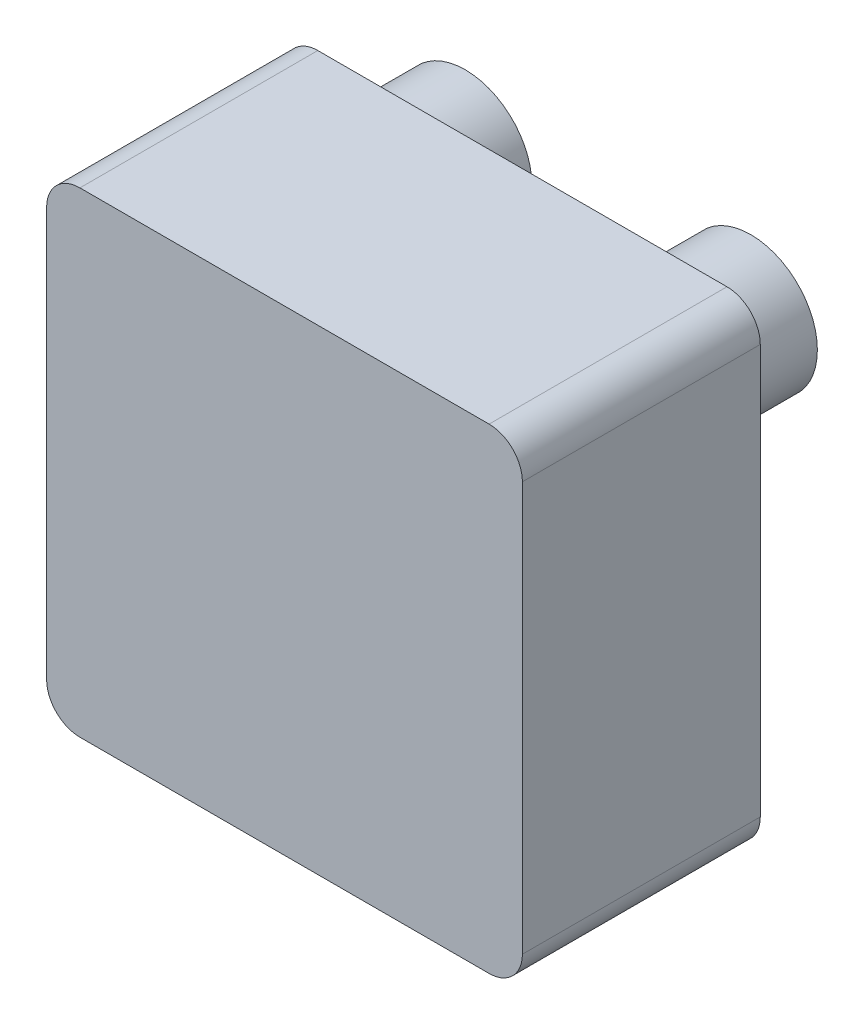
ISO-10303-21;
HEADER;
FILE_DESCRIPTION(('STEP AP214'),'2;1');
FILE_NAME('part.step','',(''),(''),'','','');
FILE_SCHEMA(('AUTOMOTIVE_DESIGN { 1 0 10303 214 1 1 1 1 }'));
ENDSEC;
DATA;
#1=APPLICATION_CONTEXT('core data for automotive mechanical design processes');
#2=APPLICATION_PROTOCOL_DEFINITION('international standard','automotive_design',2000,#1);
#3=PRODUCT_CONTEXT('',#1,'mechanical');
#4=PRODUCT('Part','Part','',(#3));
#5=PRODUCT_RELATED_PRODUCT_CATEGORY('part','',(#4));
#6=PRODUCT_DEFINITION_FORMATION('','',#4);
#7=PRODUCT_DEFINITION_CONTEXT('part definition',#1,'design');
#8=PRODUCT_DEFINITION('design','',#6,#7);
#9=PRODUCT_DEFINITION_SHAPE('','',#8);
#10=(LENGTH_UNIT() NAMED_UNIT(*) SI_UNIT(.MILLI.,.METRE.));
#11=(NAMED_UNIT(*) PLANE_ANGLE_UNIT() SI_UNIT($,.RADIAN.));
#12=(NAMED_UNIT(*) SI_UNIT($,.STERADIAN.) SOLID_ANGLE_UNIT());
#13=UNCERTAINTY_MEASURE_WITH_UNIT(LENGTH_MEASURE(1.E-05),#10,'distance_accuracy_value','');
#14=(GEOMETRIC_REPRESENTATION_CONTEXT(3) GLOBAL_UNCERTAINTY_ASSIGNED_CONTEXT((#13)) GLOBAL_UNIT_ASSIGNED_CONTEXT((#10,
#11,#12)) REPRESENTATION_CONTEXT('',''));
#15=CARTESIAN_POINT('',(0.,0.,0.));
#16=DIRECTION('',(0.,0.,1.));
#17=DIRECTION('',(1.,0.,0.));
#18=AXIS2_PLACEMENT_3D('',#15,#16,#17);
#19=CARTESIAN_POINT('',(0.,10.,0.));
#20=DIRECTION('',(1.,0.,0.));
#21=DIRECTION('',(0.,0.,-1.));
#22=AXIS2_PLACEMENT_3D('',#19,#20,#21);
#23=PLANE('',#22);
#24=DIRECTION('',(0.,-1.,0.));
#25=VECTOR('',#24,1.);
#26=CARTESIAN_POINT('',(0.,10.,-5.));
#27=LINE('',#26,#25);
#28=CARTESIAN_POINT('',(0.,9.3,-5.));
#29=VERTEX_POINT('',#28);
#30=CARTESIAN_POINT('',(0.,0.699999999999999,-5.));
#31=VERTEX_POINT('',#30);
#32=EDGE_CURVE('E241',#29,#31,#27,.T.);
#33=ORIENTED_EDGE('',*,*,#32,.T.);
#34=DIRECTION('',(0.,0.,1.));
#35=VECTOR('',#34,1.);
#36=CARTESIAN_POINT('',(0.,0.699999999999999,0.));
#37=LINE('',#36,#35);
#38=CARTESIAN_POINT('',(0.,0.699999999999999,0.));
#39=VERTEX_POINT('',#38);
#40=EDGE_CURVE('E287',#31,#39,#37,.T.);
#41=ORIENTED_EDGE('',*,*,#40,.T.);
#42=DIRECTION('',(0.,-1.,0.));
#43=VECTOR('',#42,1.);
#44=CARTESIAN_POINT('',(0.,10.,0.));
#45=LINE('',#44,#43);
#46=CARTESIAN_POINT('',(0.,9.3,0.));
#47=VERTEX_POINT('',#46);
#48=EDGE_CURVE('E254',#47,#39,#45,.T.);
#49=ORIENTED_EDGE('',*,*,#48,.F.);
#50=DIRECTION('',(0.,0.,1.));
#51=VECTOR('',#50,1.);
#52=CARTESIAN_POINT('',(0.,9.3,0.));
#53=LINE('',#52,#51);
#54=EDGE_CURVE('E285',#47,#29,#53,.F.);
#55=ORIENTED_EDGE('',*,*,#54,.T.);
#56=EDGE_LOOP('',(#33,#41,#49,#55));
#57=FACE_BOUND('',#56,.T.);
#58=ADVANCED_FACE('F38',(#57),#23,.F.);
#59=CARTESIAN_POINT('',(0.,10.,0.));
#60=DIRECTION('',(0.,0.,-1.));
#61=DIRECTION('',(-1.,0.,0.));
#62=AXIS2_PLACEMENT_3D('',#59,#60,#61);
#63=PLANE('',#62);
#64=DIRECTION('',(1.,0.,0.));
#65=VECTOR('',#64,1.);
#66=CARTESIAN_POINT('',(0.,0.,0.));
#67=LINE('',#66,#65);
#68=CARTESIAN_POINT('',(0.7,0.,0.));
#69=VERTEX_POINT('',#68);
#70=CARTESIAN_POINT('',(9.3,0.,0.));
#71=VERTEX_POINT('',#70);
#72=EDGE_CURVE('E233',#69,#71,#67,.T.);
#73=ORIENTED_EDGE('',*,*,#72,.T.);
#74=CARTESIAN_POINT('',(9.3,0.699999999999999,0.));
#75=DIRECTION('',(0.,0.,-1.));
#76=DIRECTION('',(-1.,0.,0.));
#77=AXIS2_PLACEMENT_3D('',#74,#75,#76);
#78=CIRCLE('',#77,0.7);
#79=CARTESIAN_POINT('',(10.,0.699999999999999,0.));
#80=VERTEX_POINT('',#79);
#81=EDGE_CURVE('E283',#71,#80,#78,.F.);
#82=ORIENTED_EDGE('',*,*,#81,.T.);
#83=DIRECTION('',(0.,-1.,0.));
#84=VECTOR('',#83,1.);
#85=CARTESIAN_POINT('',(10.,10.,0.));
#86=LINE('',#85,#84);
#87=CARTESIAN_POINT('',(10.,9.3,0.));
#88=VERTEX_POINT('',#87);
#89=EDGE_CURVE('E251',#88,#80,#86,.T.);
#90=ORIENTED_EDGE('',*,*,#89,.F.);
#91=CARTESIAN_POINT('',(9.3,9.3,0.));
#92=DIRECTION('',(0.,0.,-1.));
#93=DIRECTION('',(-1.,0.,0.));
#94=AXIS2_PLACEMENT_3D('',#91,#92,#93);
#95=CIRCLE('',#94,0.7);
#96=CARTESIAN_POINT('',(9.3,10.,0.));
#97=VERTEX_POINT('',#96);
#98=EDGE_CURVE('E279',#88,#97,#95,.F.);
#99=ORIENTED_EDGE('',*,*,#98,.T.);
#100=DIRECTION('',(1.,0.,0.));
#101=VECTOR('',#100,1.);
#102=CARTESIAN_POINT('',(0.,10.,0.));
#103=LINE('',#102,#101);
#104=CARTESIAN_POINT('',(0.7,10.,0.));
#105=VERTEX_POINT('',#104);
#106=EDGE_CURVE('E234',#105,#97,#103,.T.);
#107=ORIENTED_EDGE('',*,*,#106,.F.);
#108=CARTESIAN_POINT('',(0.7,9.3,0.));
#109=DIRECTION('',(0.,0.,-1.));
#110=DIRECTION('',(-1.,0.,0.));
#111=AXIS2_PLACEMENT_3D('',#108,#109,#110);
#112=CIRCLE('',#111,0.7);
#113=EDGE_CURVE('E61',#105,#47,#112,.F.);
#114=ORIENTED_EDGE('',*,*,#113,.T.);
#115=ORIENTED_EDGE('',*,*,#48,.T.);
#116=CARTESIAN_POINT('',(0.7,0.699999999999999,0.));
#117=DIRECTION('',(0.,0.,-1.));
#118=DIRECTION('',(-1.,0.,0.));
#119=AXIS2_PLACEMENT_3D('',#116,#117,#118);
#120=CIRCLE('',#119,0.7);
#121=EDGE_CURVE('E53',#39,#69,#120,.F.);
#122=ORIENTED_EDGE('',*,*,#121,.T.);
#123=EDGE_LOOP('',(#73,#82,#90,#99,#107,#114,#115,#122));
#124=FACE_BOUND('',#123,.T.);
#125=ADVANCED_FACE('F302',(#124),#63,.F.);
#126=CARTESIAN_POINT('',(10.,10.,0.));
#127=DIRECTION('',(-1.,0.,0.));
#128=DIRECTION('',(0.,0.,1.));
#129=AXIS2_PLACEMENT_3D('',#126,#127,#128);
#130=PLANE('',#129);
#131=ORIENTED_EDGE('',*,*,#89,.T.);
#132=DIRECTION('',(0.,0.,-1.));
#133=VECTOR('',#132,1.);
#134=CARTESIAN_POINT('',(10.,0.699999999999999,-5.));
#135=LINE('',#134,#133);
#136=CARTESIAN_POINT('',(10.,0.699999999999999,-5.));
#137=VERTEX_POINT('',#136);
#138=EDGE_CURVE('E264',#80,#137,#135,.T.);
#139=ORIENTED_EDGE('',*,*,#138,.T.);
#140=DIRECTION('',(0.,-1.,0.));
#141=VECTOR('',#140,1.);
#142=CARTESIAN_POINT('',(10.,10.,-5.));
#143=LINE('',#142,#141);
#144=CARTESIAN_POINT('',(10.,9.3,-5.));
#145=VERTEX_POINT('',#144);
#146=EDGE_CURVE('E249',#145,#137,#143,.T.);
#147=ORIENTED_EDGE('',*,*,#146,.F.);
#148=DIRECTION('',(0.,0.,-1.));
#149=VECTOR('',#148,1.);
#150=CARTESIAN_POINT('',(10.,9.3,0.));
#151=LINE('',#150,#149);
#152=EDGE_CURVE('E262',#145,#88,#151,.F.);
#153=ORIENTED_EDGE('',*,*,#152,.T.);
#154=EDGE_LOOP('',(#131,#139,#147,#153));
#155=FACE_BOUND('',#154,.T.);
#156=ADVANCED_FACE('F306',(#155),#130,.F.);
#157=CARTESIAN_POINT('',(0.,10.,-5.));
#158=DIRECTION('',(0.,0.,1.));
#159=DIRECTION('',(1.,0.,0.));
#160=AXIS2_PLACEMENT_3D('',#157,#158,#159);
#161=PLANE('',#160);
#162=CARTESIAN_POINT('',(2.,8.,-5.));
#163=DIRECTION('',(0.,0.,1.));
#164=DIRECTION('',(1.,0.,0.));
#165=AXIS2_PLACEMENT_3D('',#162,#163,#164);
#166=CIRCLE('',#165,1.4);
#167=CARTESIAN_POINT('',(3.4,8.,-5.));
#168=VERTEX_POINT('',#167);
#169=EDGE_CURVE('E259',#168,#168,#166,.F.);
#170=ORIENTED_EDGE('',*,*,#169,.F.);
#171=EDGE_LOOP('',(#170));
#172=FACE_BOUND('',#171,.T.);
#173=CARTESIAN_POINT('',(8.,8.,-5.));
#174=DIRECTION('',(0.,0.,1.));
#175=DIRECTION('',(1.,0.,0.));
#176=AXIS2_PLACEMENT_3D('',#173,#174,#175);
#177=CIRCLE('',#176,1.4);
#178=CARTESIAN_POINT('',(9.4,8.,-5.));
#179=VERTEX_POINT('',#178);
#180=EDGE_CURVE('E256',#179,#179,#177,.F.);
#181=ORIENTED_EDGE('',*,*,#180,.F.);
#182=EDGE_LOOP('',(#181));
#183=FACE_BOUND('',#182,.T.);
#184=ORIENTED_EDGE('',*,*,#146,.T.);
#185=CARTESIAN_POINT('',(9.3,0.699999999999999,-5.));
#186=DIRECTION('',(0.,0.,1.));
#187=DIRECTION('',(1.,0.,0.));
#188=AXIS2_PLACEMENT_3D('',#185,#186,#187);
#189=CIRCLE('',#188,0.7);
#190=CARTESIAN_POINT('',(9.3,0.,-5.));
#191=VERTEX_POINT('',#190);
#192=EDGE_CURVE('E273',#137,#191,#189,.F.);
#193=ORIENTED_EDGE('',*,*,#192,.T.);
#194=DIRECTION('',(-1.,0.,0.));
#195=VECTOR('',#194,1.);
#196=CARTESIAN_POINT('',(0.,0.,-5.));
#197=LINE('',#196,#195);
#198=CARTESIAN_POINT('',(7.5,0.,-5.));
#199=VERTEX_POINT('',#198);
#200=EDGE_CURVE('E238',#191,#199,#197,.T.);
#201=ORIENTED_EDGE('',*,*,#200,.T.);
#202=DIRECTION('',(0.,-1.,0.));
#203=VECTOR('',#202,1.);
#204=CARTESIAN_POINT('',(7.5,5.,-5.));
#205=LINE('',#204,#203);
#206=CARTESIAN_POINT('',(7.5,5.,-5.));
#207=VERTEX_POINT('',#206);
#208=EDGE_CURVE('E223',#207,#199,#205,.T.);
#209=ORIENTED_EDGE('',*,*,#208,.F.);
#210=DIRECTION('',(1.,0.,0.));
#211=VECTOR('',#210,1.);
#212=CARTESIAN_POINT('',(5.65,5.,-5.));
#213=LINE('',#212,#211);
#214=CARTESIAN_POINT('',(5.65,5.,-5.));
#215=VERTEX_POINT('',#214);
#216=EDGE_CURVE('E201',#215,#207,#213,.T.);
#217=ORIENTED_EDGE('',*,*,#216,.F.);
#218=DIRECTION('',(0.,-1.,0.));
#219=VECTOR('',#218,1.);
#220=CARTESIAN_POINT('',(5.65,5.,-5.));
#221=LINE('',#220,#219);
#222=CARTESIAN_POINT('',(5.65,0.,-5.));
#223=VERTEX_POINT('',#222);
#224=EDGE_CURVE('E211',#215,#223,#221,.T.);
#225=ORIENTED_EDGE('',*,*,#224,.T.);
#226=CARTESIAN_POINT('',(4.35,0.,-5.));
#227=VERTEX_POINT('',#226);
#228=EDGE_CURVE('E246',#223,#227,#197,.T.);
#229=ORIENTED_EDGE('',*,*,#228,.T.);
#230=DIRECTION('',(0.,-1.,0.));
#231=VECTOR('',#230,1.);
#232=CARTESIAN_POINT('',(4.35,5.,-5.));
#233=LINE('',#232,#231);
#234=CARTESIAN_POINT('',(4.35,5.,-5.));
#235=VERTEX_POINT('',#234);
#236=EDGE_CURVE('E164',#235,#227,#233,.T.);
#237=ORIENTED_EDGE('',*,*,#236,.F.);
#238=DIRECTION('',(1.,0.,0.));
#239=VECTOR('',#238,1.);
#240=CARTESIAN_POINT('',(2.5,5.,-5.));
#241=LINE('',#240,#239);
#242=CARTESIAN_POINT('',(2.5,5.,-5.));
#243=VERTEX_POINT('',#242);
#244=EDGE_CURVE('E171',#243,#235,#241,.T.);
#245=ORIENTED_EDGE('',*,*,#244,.F.);
#246=DIRECTION('',(0.,-1.,0.));
#247=VECTOR('',#246,1.);
#248=CARTESIAN_POINT('',(2.5,5.,-5.));
#249=LINE('',#248,#247);
#250=CARTESIAN_POINT('',(2.5,0.,-5.));
#251=VERTEX_POINT('',#250);
#252=EDGE_CURVE('E153',#243,#251,#249,.T.);
#253=ORIENTED_EDGE('',*,*,#252,.T.);
#254=CARTESIAN_POINT('',(0.699999999999999,0.,-5.));
#255=VERTEX_POINT('',#254);
#256=EDGE_CURVE('E244',#251,#255,#197,.T.);
#257=ORIENTED_EDGE('',*,*,#256,.T.);
#258=CARTESIAN_POINT('',(0.699999999999999,0.699999999999999,-5.));
#259=DIRECTION('',(0.,0.,1.));
#260=DIRECTION('',(1.,0.,0.));
#261=AXIS2_PLACEMENT_3D('',#258,#259,#260);
#262=CIRCLE('',#261,0.7);
#263=EDGE_CURVE('E271',#255,#31,#262,.F.);
#264=ORIENTED_EDGE('',*,*,#263,.T.);
#265=ORIENTED_EDGE('',*,*,#32,.F.);
#266=CARTESIAN_POINT('',(0.699999999999999,9.3,-5.));
#267=DIRECTION('',(0.,0.,1.));
#268=DIRECTION('',(1.,0.,0.));
#269=AXIS2_PLACEMENT_3D('',#266,#267,#268);
#270=CIRCLE('',#269,0.7);
#271=CARTESIAN_POINT('',(0.699999999999999,10.,-5.));
#272=VERTEX_POINT('',#271);
#273=EDGE_CURVE('E269',#29,#272,#270,.F.);
#274=ORIENTED_EDGE('',*,*,#273,.T.);
#275=DIRECTION('',(-1.,0.,0.));
#276=VECTOR('',#275,1.);
#277=CARTESIAN_POINT('',(0.,10.,-5.));
#278=LINE('',#277,#276);
#279=CARTESIAN_POINT('',(9.3,10.,-5.));
#280=VERTEX_POINT('',#279);
#281=EDGE_CURVE('E237',#280,#272,#278,.T.);
#282=ORIENTED_EDGE('',*,*,#281,.F.);
#283=CARTESIAN_POINT('',(9.3,9.3,-5.));
#284=DIRECTION('',(0.,0.,1.));
#285=DIRECTION('',(1.,0.,0.));
#286=AXIS2_PLACEMENT_3D('',#283,#284,#285);
#287=CIRCLE('',#286,0.7);
#288=EDGE_CURVE('E267',#280,#145,#287,.F.);
#289=ORIENTED_EDGE('',*,*,#288,.T.);
#290=EDGE_LOOP('',(#184,#193,#201,#209,#217,#225,#229,#237,#245,#253,#257,#264,#265,#274,#282,#289));
#291=FACE_BOUND('',#290,.T.);
#292=ADVANCED_FACE('F177',(#172,#183,#291),#161,.F.);
#293=CARTESIAN_POINT('',(0.,10.,0.));
#294=DIRECTION('',(0.,-1.,0.));
#295=DIRECTION('',(0.,0.,-1.));
#296=AXIS2_PLACEMENT_3D('',#293,#294,#295);
#297=PLANE('',#296);
#298=ORIENTED_EDGE('',*,*,#281,.T.);
#299=DIRECTION('',(0.,0.,1.));
#300=VECTOR('',#299,1.);
#301=CARTESIAN_POINT('',(0.7,10.,0.));
#302=LINE('',#301,#300);
#303=EDGE_CURVE('E11',#272,#105,#302,.T.);
#304=ORIENTED_EDGE('',*,*,#303,.T.);
#305=ORIENTED_EDGE('',*,*,#106,.T.);
#306=DIRECTION('',(0.,0.,-1.));
#307=VECTOR('',#306,1.);
#308=CARTESIAN_POINT('',(9.3,10.,0.));
#309=LINE('',#308,#307);
#310=EDGE_CURVE('E46',#97,#280,#309,.T.);
#311=ORIENTED_EDGE('',*,*,#310,.T.);
#312=EDGE_LOOP('',(#298,#304,#305,#311));
#313=FACE_BOUND('',#312,.T.);
#314=ADVANCED_FACE('F292',(#313),#297,.F.);
#315=CARTESIAN_POINT('',(0.,0.,0.));
#316=DIRECTION('',(0.,-1.,0.));
#317=DIRECTION('',(0.,0.,-1.));
#318=AXIS2_PLACEMENT_3D('',#315,#316,#317);
#319=PLANE('',#318);
#320=CARTESIAN_POINT('',(5.,0.,-2.5));
#321=DIRECTION('',(0.,-1.,0.));
#322=DIRECTION('',(0.,0.,-1.));
#323=AXIS2_PLACEMENT_3D('',#320,#321,#322);
#324=CIRCLE('',#323,1.2);
#325=CARTESIAN_POINT('',(5.,0.,-3.7));
#326=VERTEX_POINT('',#325);
#327=EDGE_CURVE('E557',#326,#326,#324,.T.);
#328=ORIENTED_EDGE('',*,*,#327,.F.);
#329=EDGE_LOOP('',(#328));
#330=FACE_BOUND('',#329,.T.);
#331=ORIENTED_EDGE('',*,*,#200,.F.);
#332=DIRECTION('',(0.,0.,-1.));
#333=VECTOR('',#332,1.);
#334=CARTESIAN_POINT('',(9.3,0.,0.));
#335=LINE('',#334,#333);
#336=EDGE_CURVE('E277',#191,#71,#335,.F.);
#337=ORIENTED_EDGE('',*,*,#336,.T.);
#338=ORIENTED_EDGE('',*,*,#72,.F.);
#339=DIRECTION('',(0.,0.,1.));
#340=VECTOR('',#339,1.);
#341=CARTESIAN_POINT('',(0.699999999999999,0.,-5.));
#342=LINE('',#341,#340);
#343=EDGE_CURVE('E275',#69,#255,#342,.F.);
#344=ORIENTED_EDGE('',*,*,#343,.T.);
#345=ORIENTED_EDGE('',*,*,#256,.F.);
#346=DIRECTION('',(0.,0.,-1.));
#347=VECTOR('',#346,1.);
#348=CARTESIAN_POINT('',(2.5,0.,-5.));
#349=LINE('',#348,#347);
#350=CARTESIAN_POINT('',(2.5,0.,-4.65));
#351=VERTEX_POINT('',#350);
#352=EDGE_CURVE('E159',#351,#251,#349,.T.);
#353=ORIENTED_EDGE('',*,*,#352,.F.);
#354=DIRECTION('',(-1.,0.,0.));
#355=VECTOR('',#354,1.);
#356=CARTESIAN_POINT('',(2.5,0.,-4.65));
#357=LINE('',#356,#355);
#358=CARTESIAN_POINT('',(4.35,0.,-4.65));
#359=VERTEX_POINT('',#358);
#360=EDGE_CURVE('E174',#359,#351,#357,.T.);
#361=ORIENTED_EDGE('',*,*,#360,.F.);
#362=DIRECTION('',(0.,0.,1.));
#363=VECTOR('',#362,1.);
#364=CARTESIAN_POINT('',(4.35,0.,-5.));
#365=LINE('',#364,#363);
#366=EDGE_CURVE('E186',#227,#359,#365,.T.);
#367=ORIENTED_EDGE('',*,*,#366,.F.);
#368=ORIENTED_EDGE('',*,*,#228,.F.);
#369=DIRECTION('',(0.,0.,-1.));
#370=VECTOR('',#369,1.);
#371=CARTESIAN_POINT('',(5.65,0.,-5.));
#372=LINE('',#371,#370);
#373=CARTESIAN_POINT('',(5.65,0.,-4.65));
#374=VERTEX_POINT('',#373);
#375=EDGE_CURVE('E212',#374,#223,#372,.T.);
#376=ORIENTED_EDGE('',*,*,#375,.F.);
#377=DIRECTION('',(-1.,0.,0.));
#378=VECTOR('',#377,1.);
#379=CARTESIAN_POINT('',(5.65,0.,-4.65));
#380=LINE('',#379,#378);
#381=CARTESIAN_POINT('',(7.5,0.,-4.65));
#382=VERTEX_POINT('',#381);
#383=EDGE_CURVE('E202',#382,#374,#380,.T.);
#384=ORIENTED_EDGE('',*,*,#383,.F.);
#385=DIRECTION('',(0.,0.,1.));
#386=VECTOR('',#385,1.);
#387=CARTESIAN_POINT('',(7.5,0.,-5.));
#388=LINE('',#387,#386);
#389=EDGE_CURVE('E214',#199,#382,#388,.T.);
#390=ORIENTED_EDGE('',*,*,#389,.F.);
#391=EDGE_LOOP('',(#331,#337,#338,#344,#345,#353,#361,#367,#368,#376,#384,#390));
#392=FACE_BOUND('',#391,.T.);
#393=ADVANCED_FACE('F314',(#330,#392),#319,.T.);
#394=CARTESIAN_POINT('',(8.,8.,-6.8));
#395=DIRECTION('',(0.,0.,1.));
#396=DIRECTION('',(1.,0.,0.));
#397=AXIS2_PLACEMENT_3D('',#394,#395,#396);
#398=CYLINDRICAL_SURFACE('',#397,1.4);
#399=CARTESIAN_POINT('',(8.,8.,-6.8));
#400=DIRECTION('',(0.,0.,-1.));
#401=DIRECTION('',(-1.,0.,0.));
#402=AXIS2_PLACEMENT_3D('',#399,#400,#401);
#403=CIRCLE('',#402,1.4);
#404=CARTESIAN_POINT('',(6.6,8.,-6.8));
#405=VERTEX_POINT('',#404);
#406=EDGE_CURVE('E230',#405,#405,#403,.T.);
#407=ORIENTED_EDGE('',*,*,#406,.F.);
#408=EDGE_LOOP('',(#407));
#409=FACE_BOUND('',#408,.T.);
#410=ORIENTED_EDGE('',*,*,#180,.T.);
#411=EDGE_LOOP('',(#410));
#412=FACE_BOUND('',#411,.T.);
#413=ADVANCED_FACE('F367',(#409,#412),#398,.T.);
#414=CARTESIAN_POINT('',(8.,8.,-6.8));
#415=DIRECTION('',(0.,0.,-1.));
#416=DIRECTION('',(-1.,0.,0.));
#417=AXIS2_PLACEMENT_3D('',#414,#415,#416);
#418=PLANE('',#417);
#419=ORIENTED_EDGE('',*,*,#406,.T.);
#420=EDGE_LOOP('',(#419));
#421=FACE_BOUND('',#420,.T.);
#422=ADVANCED_FACE('F517',(#421),#418,.T.);
#423=CARTESIAN_POINT('',(2.,8.,-6.8));
#424=DIRECTION('',(0.,0.,1.));
#425=DIRECTION('',(1.,0.,0.));
#426=AXIS2_PLACEMENT_3D('',#423,#424,#425);
#427=CYLINDRICAL_SURFACE('',#426,1.4);
#428=CARTESIAN_POINT('',(2.,8.,-6.8));
#429=DIRECTION('',(0.,0.,-1.));
#430=DIRECTION('',(-1.,0.,0.));
#431=AXIS2_PLACEMENT_3D('',#428,#429,#430);
#432=CIRCLE('',#431,1.4);
#433=CARTESIAN_POINT('',(0.599999999999999,8.,-6.8));
#434=VERTEX_POINT('',#433);
#435=EDGE_CURVE('E194',#434,#434,#432,.T.);
#436=ORIENTED_EDGE('',*,*,#435,.F.);
#437=EDGE_LOOP('',(#436));
#438=FACE_BOUND('',#437,.T.);
#439=ORIENTED_EDGE('',*,*,#169,.T.);
#440=EDGE_LOOP('',(#439));
#441=FACE_BOUND('',#440,.T.);
#442=ADVANCED_FACE('F507',(#438,#441),#427,.T.);
#443=CARTESIAN_POINT('',(2.,8.,-6.8));
#444=DIRECTION('',(0.,0.,-1.));
#445=DIRECTION('',(-1.,0.,0.));
#446=AXIS2_PLACEMENT_3D('',#443,#444,#445);
#447=PLANE('',#446);
#448=ORIENTED_EDGE('',*,*,#435,.T.);
#449=EDGE_LOOP('',(#448));
#450=FACE_BOUND('',#449,.T.);
#451=ADVANCED_FACE('F497',(#450),#447,.T.);
#452=CARTESIAN_POINT('',(5.65,5.,-5.));
#453=DIRECTION('',(-1.,0.,0.));
#454=DIRECTION('',(0.,0.,1.));
#455=AXIS2_PLACEMENT_3D('',#452,#453,#454);
#456=PLANE('',#455);
#457=ORIENTED_EDGE('',*,*,#375,.T.);
#458=ORIENTED_EDGE('',*,*,#224,.F.);
#459=DIRECTION('',(0.,0.,-1.));
#460=VECTOR('',#459,1.);
#461=CARTESIAN_POINT('',(5.65,5.,-5.));
#462=LINE('',#461,#460);
#463=CARTESIAN_POINT('',(5.65,5.,-4.65));
#464=VERTEX_POINT('',#463);
#465=EDGE_CURVE('E198',#464,#215,#462,.T.);
#466=ORIENTED_EDGE('',*,*,#465,.F.);
#467=DIRECTION('',(0.,-1.,0.));
#468=VECTOR('',#467,1.);
#469=CARTESIAN_POINT('',(5.65,5.,-4.65));
#470=LINE('',#469,#468);
#471=EDGE_CURVE('E187',#464,#374,#470,.T.);
#472=ORIENTED_EDGE('',*,*,#471,.T.);
#473=EDGE_LOOP('',(#457,#458,#466,#472));
#474=FACE_BOUND('',#473,.T.);
#475=ADVANCED_FACE('F487',(#474),#456,.F.);
#476=CARTESIAN_POINT('',(5.65,5.,-4.65));
#477=DIRECTION('',(0.,0.,1.));
#478=DIRECTION('',(1.,0.,0.));
#479=AXIS2_PLACEMENT_3D('',#476,#477,#478);
#480=PLANE('',#479);
#481=ORIENTED_EDGE('',*,*,#383,.T.);
#482=ORIENTED_EDGE('',*,*,#471,.F.);
#483=DIRECTION('',(-1.,0.,0.));
#484=VECTOR('',#483,1.);
#485=CARTESIAN_POINT('',(5.65,5.,-4.65));
#486=LINE('',#485,#484);
#487=CARTESIAN_POINT('',(7.5,5.,-4.65));
#488=VERTEX_POINT('',#487);
#489=EDGE_CURVE('E208',#488,#464,#486,.T.);
#490=ORIENTED_EDGE('',*,*,#489,.F.);
#491=DIRECTION('',(0.,-1.,0.));
#492=VECTOR('',#491,1.);
#493=CARTESIAN_POINT('',(7.5,5.,-4.65));
#494=LINE('',#493,#492);
#495=EDGE_CURVE('E221',#488,#382,#494,.T.);
#496=ORIENTED_EDGE('',*,*,#495,.T.);
#497=EDGE_LOOP('',(#481,#482,#490,#496));
#498=FACE_BOUND('',#497,.T.);
#499=ADVANCED_FACE('F477',(#498),#480,.F.);
#500=CARTESIAN_POINT('',(7.5,5.,-5.));
#501=DIRECTION('',(1.,0.,0.));
#502=DIRECTION('',(0.,0.,-1.));
#503=AXIS2_PLACEMENT_3D('',#500,#501,#502);
#504=PLANE('',#503);
#505=ORIENTED_EDGE('',*,*,#389,.T.);
#506=ORIENTED_EDGE('',*,*,#495,.F.);
#507=DIRECTION('',(0.,0.,1.));
#508=VECTOR('',#507,1.);
#509=CARTESIAN_POINT('',(7.5,5.,-5.));
#510=LINE('',#509,#508);
#511=EDGE_CURVE('E205',#207,#488,#510,.T.);
#512=ORIENTED_EDGE('',*,*,#511,.F.);
#513=ORIENTED_EDGE('',*,*,#208,.T.);
#514=EDGE_LOOP('',(#505,#506,#512,#513));
#515=FACE_BOUND('',#514,.T.);
#516=ADVANCED_FACE('F467',(#515),#504,.F.);
#517=CARTESIAN_POINT('',(0.,5.,0.));
#518=DIRECTION('',(0.,1.,0.));
#519=DIRECTION('',(0.,0.,1.));
#520=AXIS2_PLACEMENT_3D('',#517,#518,#519);
#521=PLANE('',#520);
#522=ORIENTED_EDGE('',*,*,#465,.T.);
#523=ORIENTED_EDGE('',*,*,#216,.T.);
#524=ORIENTED_EDGE('',*,*,#511,.T.);
#525=ORIENTED_EDGE('',*,*,#489,.T.);
#526=EDGE_LOOP('',(#522,#523,#524,#525));
#527=FACE_BOUND('',#526,.T.);
#528=ADVANCED_FACE('F458',(#527),#521,.F.);
#529=CARTESIAN_POINT('',(2.5,5.,-5.));
#530=DIRECTION('',(-1.,0.,0.));
#531=DIRECTION('',(0.,0.,1.));
#532=AXIS2_PLACEMENT_3D('',#529,#530,#531);
#533=PLANE('',#532);
#534=ORIENTED_EDGE('',*,*,#352,.T.);
#535=ORIENTED_EDGE('',*,*,#252,.F.);
#536=DIRECTION('',(0.,0.,-1.));
#537=VECTOR('',#536,1.);
#538=CARTESIAN_POINT('',(2.5,5.,-5.));
#539=LINE('',#538,#537);
#540=CARTESIAN_POINT('',(2.5,5.,-4.65));
#541=VERTEX_POINT('',#540);
#542=EDGE_CURVE('E156',#541,#243,#539,.T.);
#543=ORIENTED_EDGE('',*,*,#542,.F.);
#544=DIRECTION('',(0.,-1.,0.));
#545=VECTOR('',#544,1.);
#546=CARTESIAN_POINT('',(2.5,5.,-4.65));
#547=LINE('',#546,#545);
#548=EDGE_CURVE('E192',#541,#351,#547,.T.);
#549=ORIENTED_EDGE('',*,*,#548,.T.);
#550=EDGE_LOOP('',(#534,#535,#543,#549));
#551=FACE_BOUND('',#550,.T.);
#552=ADVANCED_FACE('F155',(#551),#533,.F.);
#553=CARTESIAN_POINT('',(2.5,5.,-4.65));
#554=DIRECTION('',(0.,0.,1.));
#555=DIRECTION('',(1.,0.,0.));
#556=AXIS2_PLACEMENT_3D('',#553,#554,#555);
#557=PLANE('',#556);
#558=ORIENTED_EDGE('',*,*,#360,.T.);
#559=ORIENTED_EDGE('',*,*,#548,.F.);
#560=DIRECTION('',(-1.,0.,0.));
#561=VECTOR('',#560,1.);
#562=CARTESIAN_POINT('',(2.5,5.,-4.65));
#563=LINE('',#562,#561);
#564=CARTESIAN_POINT('',(4.35,5.,-4.65));
#565=VERTEX_POINT('',#564);
#566=EDGE_CURVE('E165',#565,#541,#563,.T.);
#567=ORIENTED_EDGE('',*,*,#566,.F.);
#568=DIRECTION('',(0.,-1.,0.));
#569=VECTOR('',#568,1.);
#570=CARTESIAN_POINT('',(4.35,5.,-4.65));
#571=LINE('',#570,#569);
#572=EDGE_CURVE('E195',#565,#359,#571,.T.);
#573=ORIENTED_EDGE('',*,*,#572,.T.);
#574=EDGE_LOOP('',(#558,#559,#567,#573));
#575=FACE_BOUND('',#574,.T.);
#576=ADVANCED_FACE('F439',(#575),#557,.F.);
#577=CARTESIAN_POINT('',(4.35,5.,-5.));
#578=DIRECTION('',(1.,0.,0.));
#579=DIRECTION('',(0.,0.,-1.));
#580=AXIS2_PLACEMENT_3D('',#577,#578,#579);
#581=PLANE('',#580);
#582=ORIENTED_EDGE('',*,*,#366,.T.);
#583=ORIENTED_EDGE('',*,*,#572,.F.);
#584=DIRECTION('',(0.,0.,1.));
#585=VECTOR('',#584,1.);
#586=CARTESIAN_POINT('',(4.35,5.,-5.));
#587=LINE('',#586,#585);
#588=EDGE_CURVE('E179',#235,#565,#587,.T.);
#589=ORIENTED_EDGE('',*,*,#588,.F.);
#590=ORIENTED_EDGE('',*,*,#236,.T.);
#591=EDGE_LOOP('',(#582,#583,#589,#590));
#592=FACE_BOUND('',#591,.T.);
#593=ADVANCED_FACE('F430',(#592),#581,.F.);
#594=CARTESIAN_POINT('',(0.,5.,0.));
#595=DIRECTION('',(0.,1.,0.));
#596=DIRECTION('',(0.,0.,1.));
#597=AXIS2_PLACEMENT_3D('',#594,#595,#596);
#598=PLANE('',#597);
#599=ORIENTED_EDGE('',*,*,#542,.T.);
#600=ORIENTED_EDGE('',*,*,#244,.T.);
#601=ORIENTED_EDGE('',*,*,#588,.T.);
#602=ORIENTED_EDGE('',*,*,#566,.T.);
#603=EDGE_LOOP('',(#599,#600,#601,#602));
#604=FACE_BOUND('',#603,.T.);
#605=ADVANCED_FACE('F169',(#604),#598,.F.);
#606=CARTESIAN_POINT('',(5.,3.5,-2.5));
#607=DIRECTION('',(0.,-1.,0.));
#608=DIRECTION('',(0.,0.,-1.));
#609=AXIS2_PLACEMENT_3D('',#606,#607,#608);
#610=CYLINDRICAL_SURFACE('',#609,1.2);
#611=CARTESIAN_POINT('',(5.,3.5,-2.5));
#612=DIRECTION('',(0.,-1.,0.));
#613=DIRECTION('',(0.,0.,-1.));
#614=AXIS2_PLACEMENT_3D('',#611,#612,#613);
#615=CIRCLE('',#614,1.2);
#616=CARTESIAN_POINT('',(5.,3.5,-3.7));
#617=VERTEX_POINT('',#616);
#618=EDGE_CURVE('E215',#617,#617,#615,.T.);
#619=ORIENTED_EDGE('',*,*,#618,.F.);
#620=EDGE_LOOP('',(#619));
#621=FACE_BOUND('',#620,.T.);
#622=ORIENTED_EDGE('',*,*,#327,.T.);
#623=EDGE_LOOP('',(#622));
#624=FACE_BOUND('',#623,.T.);
#625=ADVANCED_FACE('F411',(#621,#624),#610,.F.);
#626=CARTESIAN_POINT('',(5.,3.5,-2.5));
#627=DIRECTION('',(0.,-1.,0.));
#628=DIRECTION('',(0.,0.,-1.));
#629=AXIS2_PLACEMENT_3D('',#626,#627,#628);
#630=PLANE('',#629);
#631=ORIENTED_EDGE('',*,*,#618,.T.);
#632=EDGE_LOOP('',(#631));
#633=FACE_BOUND('',#632,.T.);
#634=ADVANCED_FACE('F332',(#633),#630,.T.);
#635=CARTESIAN_POINT('',(9.3,0.699999999999999,0.));
#636=DIRECTION('',(0.,0.,1.));
#637=DIRECTION('',(1.,0.,0.));
#638=AXIS2_PLACEMENT_3D('',#635,#636,#637);
#639=CYLINDRICAL_SURFACE('',#638,0.7);
#640=ORIENTED_EDGE('',*,*,#81,.F.);
#641=ORIENTED_EDGE('',*,*,#336,.F.);
#642=ORIENTED_EDGE('',*,*,#192,.F.);
#643=ORIENTED_EDGE('',*,*,#138,.F.);
#644=EDGE_LOOP('',(#640,#641,#642,#643));
#645=FACE_BOUND('',#644,.T.);
#646=ADVANCED_FACE('F318',(#645),#639,.T.);
#647=CARTESIAN_POINT('',(0.7,0.699999999999999,0.));
#648=DIRECTION('',(0.,0.,-1.));
#649=DIRECTION('',(-1.,0.,0.));
#650=AXIS2_PLACEMENT_3D('',#647,#648,#649);
#651=CYLINDRICAL_SURFACE('',#650,0.7);
#652=ORIENTED_EDGE('',*,*,#263,.F.);
#653=ORIENTED_EDGE('',*,*,#343,.F.);
#654=ORIENTED_EDGE('',*,*,#121,.F.);
#655=ORIENTED_EDGE('',*,*,#40,.F.);
#656=EDGE_LOOP('',(#652,#653,#654,#655));
#657=FACE_BOUND('',#656,.T.);
#658=ADVANCED_FACE('F320',(#657),#651,.T.);
#659=CARTESIAN_POINT('',(0.7,9.3,0.));
#660=DIRECTION('',(0.,0.,1.));
#661=DIRECTION('',(1.,0.,0.));
#662=AXIS2_PLACEMENT_3D('',#659,#660,#661);
#663=CYLINDRICAL_SURFACE('',#662,0.7);
#664=ORIENTED_EDGE('',*,*,#273,.F.);
#665=ORIENTED_EDGE('',*,*,#54,.F.);
#666=ORIENTED_EDGE('',*,*,#113,.F.);
#667=ORIENTED_EDGE('',*,*,#303,.F.);
#668=EDGE_LOOP('',(#664,#665,#666,#667));
#669=FACE_BOUND('',#668,.T.);
#670=ADVANCED_FACE('F301',(#669),#663,.T.);
#671=CARTESIAN_POINT('',(9.3,9.3,0.));
#672=DIRECTION('',(0.,0.,-1.));
#673=DIRECTION('',(-1.,0.,0.));
#674=AXIS2_PLACEMENT_3D('',#671,#672,#673);
#675=CYLINDRICAL_SURFACE('',#674,0.7);
#676=ORIENTED_EDGE('',*,*,#98,.F.);
#677=ORIENTED_EDGE('',*,*,#152,.F.);
#678=ORIENTED_EDGE('',*,*,#288,.F.);
#679=ORIENTED_EDGE('',*,*,#310,.F.);
#680=EDGE_LOOP('',(#676,#677,#678,#679));
#681=FACE_BOUND('',#680,.T.);
#682=ADVANCED_FACE('F40',(#681),#675,.T.);
#683=CLOSED_SHELL('',(#58,#125,#156,#292,#314,#393,#413,#422,#442,#451,#475,#499,#516,#528,#552,
#576,#593,#605,#625,#634,#646,#658,#670,#682));
#684=MANIFOLD_SOLID_BREP('B2',#683);
#685=ADVANCED_BREP_SHAPE_REPRESENTATION('',(#18,#684),#14);
#686=SHAPE_DEFINITION_REPRESENTATION(#9,#685);
ENDSEC;
END-ISO-10303-21;
